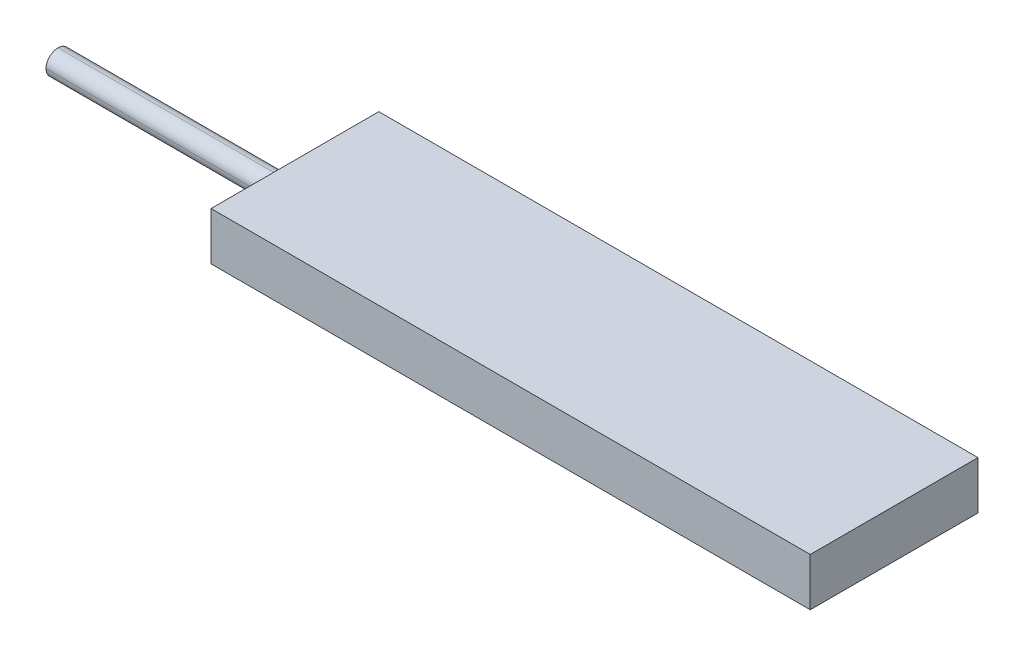
ISO-10303-21;
HEADER;
FILE_DESCRIPTION(('STEP AP214'),'2;1');
FILE_NAME('part.step','',(''),(''),'','','');
FILE_SCHEMA(('AUTOMOTIVE_DESIGN { 1 0 10303 214 1 1 1 1 }'));
ENDSEC;
DATA;
#1=APPLICATION_CONTEXT('core data for automotive mechanical design processes');
#2=APPLICATION_PROTOCOL_DEFINITION('international standard','automotive_design',2000,#1);
#3=PRODUCT_CONTEXT('',#1,'mechanical');
#4=PRODUCT('Part','Part','',(#3));
#5=PRODUCT_RELATED_PRODUCT_CATEGORY('part','',(#4));
#6=PRODUCT_DEFINITION_FORMATION('','',#4);
#7=PRODUCT_DEFINITION_CONTEXT('part definition',#1,'design');
#8=PRODUCT_DEFINITION('design','',#6,#7);
#9=PRODUCT_DEFINITION_SHAPE('','',#8);
#10=(LENGTH_UNIT() NAMED_UNIT(*) SI_UNIT(.MILLI.,.METRE.));
#11=(NAMED_UNIT(*) PLANE_ANGLE_UNIT() SI_UNIT($,.RADIAN.));
#12=(NAMED_UNIT(*) SI_UNIT($,.STERADIAN.) SOLID_ANGLE_UNIT());
#13=UNCERTAINTY_MEASURE_WITH_UNIT(LENGTH_MEASURE(1.E-05),#10,'distance_accuracy_value','');
#14=(GEOMETRIC_REPRESENTATION_CONTEXT(3) GLOBAL_UNCERTAINTY_ASSIGNED_CONTEXT((#13)) GLOBAL_UNIT_ASSIGNED_CONTEXT((#10,
#11,#12)) REPRESENTATION_CONTEXT('',''));
#15=CARTESIAN_POINT('',(0.,0.,0.));
#16=DIRECTION('',(0.,0.,1.));
#17=DIRECTION('',(1.,0.,0.));
#18=AXIS2_PLACEMENT_3D('',#15,#16,#17);
#19=CARTESIAN_POINT('',(0.,1.,-4.11315782408883));
#20=DIRECTION('',(-1.,0.,0.));
#21=DIRECTION('',(0.,0.,1.));
#22=AXIS2_PLACEMENT_3D('',#19,#20,#21);
#23=PLANE('',#22);
#24=DIRECTION('',(0.,0.,-1.));
#25=VECTOR('',#24,1.);
#26=CARTESIAN_POINT('',(0.,0.,0.));
#27=LINE('',#26,#25);
#28=CARTESIAN_POINT('',(0.,0.,0.));
#29=VERTEX_POINT('',#28);
#30=CARTESIAN_POINT('',(0.,0.,-7.));
#31=VERTEX_POINT('',#30);
#32=EDGE_CURVE('E102',#29,#31,#27,.T.);
#33=ORIENTED_EDGE('',*,*,#32,.F.);
#34=DIRECTION('',(0.,-1.,0.));
#35=VECTOR('',#34,1.);
#36=CARTESIAN_POINT('',(0.,2.,0.));
#37=LINE('',#36,#35);
#38=CARTESIAN_POINT('',(0.,2.,0.));
#39=VERTEX_POINT('',#38);
#40=EDGE_CURVE('E105',#39,#29,#37,.T.);
#41=ORIENTED_EDGE('',*,*,#40,.F.);
#42=DIRECTION('',(0.,0.,-1.));
#43=VECTOR('',#42,1.);
#44=CARTESIAN_POINT('',(0.,2.,0.));
#45=LINE('',#44,#43);
#46=CARTESIAN_POINT('',(0.,2.,-7.));
#47=VERTEX_POINT('',#46);
#48=EDGE_CURVE('E129',#39,#47,#45,.T.);
#49=ORIENTED_EDGE('',*,*,#48,.T.);
#50=DIRECTION('',(0.,-1.,0.));
#51=VECTOR('',#50,1.);
#52=CARTESIAN_POINT('',(0.,2.,-7.));
#53=LINE('',#52,#51);
#54=EDGE_CURVE('E89',#47,#31,#53,.T.);
#55=ORIENTED_EDGE('',*,*,#54,.T.);
#56=EDGE_LOOP('',(#33,#41,#49,#55));
#57=FACE_BOUND('',#56,.T.);
#58=ADVANCED_FACE('F54',(#57),#23,.T.);
#59=CARTESIAN_POINT('',(0.,0.,0.));
#60=DIRECTION('',(0.,1.,0.));
#61=DIRECTION('',(0.,0.,1.));
#62=AXIS2_PLACEMENT_3D('',#59,#60,#61);
#63=PLANE('',#62);
#64=DIRECTION('',(1.,0.,0.));
#65=VECTOR('',#64,1.);
#66=CARTESIAN_POINT('',(0.,0.,0.));
#67=LINE('',#66,#65);
#68=CARTESIAN_POINT('',(25.,0.,0.));
#69=VERTEX_POINT('',#68);
#70=EDGE_CURVE('E111',#29,#69,#67,.T.);
#71=ORIENTED_EDGE('',*,*,#70,.F.);
#72=ORIENTED_EDGE('',*,*,#32,.T.);
#73=DIRECTION('',(1.,0.,0.));
#74=VECTOR('',#73,1.);
#75=CARTESIAN_POINT('',(0.,0.,-7.));
#76=LINE('',#75,#74);
#77=CARTESIAN_POINT('',(25.,0.,-7.00000000000001));
#78=VERTEX_POINT('',#77);
#79=EDGE_CURVE('E65',#31,#78,#76,.T.);
#80=ORIENTED_EDGE('',*,*,#79,.T.);
#81=DIRECTION('',(0.,0.,1.));
#82=VECTOR('',#81,1.);
#83=CARTESIAN_POINT('',(25.,0.,0.));
#84=LINE('',#83,#82);
#85=EDGE_CURVE('E13',#78,#69,#84,.T.);
#86=ORIENTED_EDGE('',*,*,#85,.T.);
#87=EDGE_LOOP('',(#71,#72,#80,#86));
#88=FACE_BOUND('',#87,.T.);
#89=ADVANCED_FACE('F56',(#88),#63,.F.);
#90=CARTESIAN_POINT('',(25.,2.,0.));
#91=DIRECTION('',(1.,0.,0.));
#92=DIRECTION('',(0.,0.,-1.));
#93=AXIS2_PLACEMENT_3D('',#90,#91,#92);
#94=PLANE('',#93);
#95=ORIENTED_EDGE('',*,*,#85,.F.);
#96=DIRECTION('',(0.,-1.,0.));
#97=VECTOR('',#96,1.);
#98=CARTESIAN_POINT('',(25.,2.,-7.00000000000001));
#99=LINE('',#98,#97);
#100=CARTESIAN_POINT('',(25.,2.,-7.00000000000001));
#101=VERTEX_POINT('',#100);
#102=EDGE_CURVE('E74',#101,#78,#99,.T.);
#103=ORIENTED_EDGE('',*,*,#102,.F.);
#104=DIRECTION('',(0.,0.,1.));
#105=VECTOR('',#104,1.);
#106=CARTESIAN_POINT('',(25.,2.,0.));
#107=LINE('',#106,#105);
#108=CARTESIAN_POINT('',(25.,2.,0.));
#109=VERTEX_POINT('',#108);
#110=EDGE_CURVE('E58',#101,#109,#107,.T.);
#111=ORIENTED_EDGE('',*,*,#110,.T.);
#112=DIRECTION('',(0.,-1.,0.));
#113=VECTOR('',#112,1.);
#114=CARTESIAN_POINT('',(25.,2.,0.));
#115=LINE('',#114,#113);
#116=EDGE_CURVE('E98',#109,#69,#115,.T.);
#117=ORIENTED_EDGE('',*,*,#116,.T.);
#118=EDGE_LOOP('',(#95,#103,#111,#117));
#119=FACE_BOUND('',#118,.T.);
#120=ADVANCED_FACE('F135',(#119),#94,.T.);
#121=CARTESIAN_POINT('',(0.,2.,-7.));
#122=DIRECTION('',(0.,0.,-1.));
#123=DIRECTION('',(-1.,0.,0.));
#124=AXIS2_PLACEMENT_3D('',#121,#122,#123);
#125=PLANE('',#124);
#126=ORIENTED_EDGE('',*,*,#79,.F.);
#127=ORIENTED_EDGE('',*,*,#54,.F.);
#128=DIRECTION('',(1.,0.,0.));
#129=VECTOR('',#128,1.);
#130=CARTESIAN_POINT('',(0.,2.,-7.));
#131=LINE('',#130,#129);
#132=EDGE_CURVE('E122',#47,#101,#131,.T.);
#133=ORIENTED_EDGE('',*,*,#132,.T.);
#134=ORIENTED_EDGE('',*,*,#102,.T.);
#135=EDGE_LOOP('',(#126,#127,#133,#134));
#136=FACE_BOUND('',#135,.T.);
#137=ADVANCED_FACE('F132',(#136),#125,.T.);
#138=CARTESIAN_POINT('',(0.,2.,0.));
#139=DIRECTION('',(0.,0.,-1.));
#140=DIRECTION('',(-1.,0.,0.));
#141=AXIS2_PLACEMENT_3D('',#138,#139,#140);
#142=PLANE('',#141);
#143=ORIENTED_EDGE('',*,*,#70,.T.);
#144=ORIENTED_EDGE('',*,*,#116,.F.);
#145=DIRECTION('',(1.,0.,0.));
#146=VECTOR('',#145,1.);
#147=CARTESIAN_POINT('',(0.,2.,0.));
#148=LINE('',#147,#146);
#149=EDGE_CURVE('E115',#39,#109,#148,.T.);
#150=ORIENTED_EDGE('',*,*,#149,.F.);
#151=ORIENTED_EDGE('',*,*,#40,.T.);
#152=EDGE_LOOP('',(#143,#144,#150,#151));
#153=FACE_BOUND('',#152,.T.);
#154=ADVANCED_FACE('F114',(#153),#142,.F.);
#155=CARTESIAN_POINT('',(0.,2.,0.));
#156=DIRECTION('',(0.,1.,0.));
#157=DIRECTION('',(0.,0.,1.));
#158=AXIS2_PLACEMENT_3D('',#155,#156,#157);
#159=PLANE('',#158);
#160=ORIENTED_EDGE('',*,*,#110,.F.);
#161=ORIENTED_EDGE('',*,*,#132,.F.);
#162=ORIENTED_EDGE('',*,*,#48,.F.);
#163=ORIENTED_EDGE('',*,*,#149,.T.);
#164=EDGE_LOOP('',(#160,#161,#162,#163));
#165=FACE_BOUND('',#164,.T.);
#166=ADVANCED_FACE('F134',(#165),#159,.T.);
#167=CLOSED_SHELL('',(#58,#89,#120,#137,#154,#166));
#168=MANIFOLD_SOLID_BREP('B2',#167);
#169=CARTESIAN_POINT('',(0.,1.,-4.11315782408883));
#170=DIRECTION('',(-1.,0.,0.));
#171=DIRECTION('',(0.,0.,1.));
#172=AXIS2_PLACEMENT_3D('',#169,#170,#171);
#173=PLANE('',#172);
#174=CARTESIAN_POINT('',(0.,0.5,-3.61315782408883));
#175=DIRECTION('',(-1.,0.,0.));
#176=DIRECTION('',(0.,0.,1.));
#177=AXIS2_PLACEMENT_3D('',#174,#175,#176);
#178=CIRCLE('',#177,0.5);
#179=CARTESIAN_POINT('',(0.,0.5,-3.11315782408883));
#180=VERTEX_POINT('',#179);
#181=CARTESIAN_POINT('',(0.,0.,-3.61315782408883));
#182=VERTEX_POINT('',#181);
#183=EDGE_CURVE('E212',#180,#182,#178,.F.);
#184=ORIENTED_EDGE('',*,*,#183,.T.);
#185=CARTESIAN_POINT('',(0.,0.5,-3.61315782408883));
#186=DIRECTION('',(-1.,0.,0.));
#187=DIRECTION('',(0.,0.,1.));
#188=AXIS2_PLACEMENT_3D('',#185,#186,#187);
#189=CIRCLE('',#188,0.5);
#190=CARTESIAN_POINT('',(0.,0.5,-4.11315782408883));
#191=VERTEX_POINT('',#190);
#192=EDGE_CURVE('E52',#182,#191,#189,.F.);
#193=ORIENTED_EDGE('',*,*,#192,.T.);
#194=CARTESIAN_POINT('',(0.,0.5,-3.61315782408883));
#195=DIRECTION('',(-1.,0.,0.));
#196=DIRECTION('',(0.,0.,1.));
#197=AXIS2_PLACEMENT_3D('',#194,#195,#196);
#198=CIRCLE('',#197,0.5);
#199=CARTESIAN_POINT('',(0.,1.,-3.61315782408883));
#200=VERTEX_POINT('',#199);
#201=EDGE_CURVE('E205',#191,#200,#198,.F.);
#202=ORIENTED_EDGE('',*,*,#201,.T.);
#203=CARTESIAN_POINT('',(0.,0.5,-3.61315782408883));
#204=DIRECTION('',(-1.,0.,0.));
#205=DIRECTION('',(0.,0.,1.));
#206=AXIS2_PLACEMENT_3D('',#203,#204,#205);
#207=CIRCLE('',#206,0.5);
#208=EDGE_CURVE('E217',#200,#180,#207,.F.);
#209=ORIENTED_EDGE('',*,*,#208,.T.);
#210=EDGE_LOOP('',(#184,#193,#202,#209));
#211=FACE_BOUND('',#210,.T.);
#212=ADVANCED_FACE('F196',(#211),#173,.F.);
#213=CARTESIAN_POINT('',(-10.,1.,0.));
#214=DIRECTION('',(1.,0.,0.));
#215=DIRECTION('',(0.,0.,-1.));
#216=AXIS2_PLACEMENT_3D('',#213,#214,#215);
#217=PLANE('',#216);
#218=CARTESIAN_POINT('',(-10.,0.5,-3.61315782408883));
#219=DIRECTION('',(1.,0.,0.));
#220=DIRECTION('',(0.,0.,-1.));
#221=AXIS2_PLACEMENT_3D('',#218,#219,#220);
#222=CIRCLE('',#221,0.5);
#223=CARTESIAN_POINT('',(-10.,1.,-3.61315782408883));
#224=VERTEX_POINT('',#223);
#225=CARTESIAN_POINT('',(-10.,0.5,-4.11315782408883));
#226=VERTEX_POINT('',#225);
#227=EDGE_CURVE('E252',#224,#226,#222,.F.);
#228=ORIENTED_EDGE('',*,*,#227,.T.);
#229=CARTESIAN_POINT('',(-10.,0.5,-3.61315782408883));
#230=DIRECTION('',(1.,0.,0.));
#231=DIRECTION('',(0.,0.,-1.));
#232=AXIS2_PLACEMENT_3D('',#229,#230,#231);
#233=CIRCLE('',#232,0.5);
#234=CARTESIAN_POINT('',(-10.,0.,-3.61315782408883));
#235=VERTEX_POINT('',#234);
#236=EDGE_CURVE('E242',#226,#235,#233,.F.);
#237=ORIENTED_EDGE('',*,*,#236,.T.);
#238=CARTESIAN_POINT('',(-10.,0.5,-3.61315782408883));
#239=DIRECTION('',(1.,0.,0.));
#240=DIRECTION('',(0.,0.,-1.));
#241=AXIS2_PLACEMENT_3D('',#238,#239,#240);
#242=CIRCLE('',#241,0.5);
#243=CARTESIAN_POINT('',(-10.,0.5,-3.11315782408883));
#244=VERTEX_POINT('',#243);
#245=EDGE_CURVE('E248',#235,#244,#242,.F.);
#246=ORIENTED_EDGE('',*,*,#245,.T.);
#247=CARTESIAN_POINT('',(-10.,0.5,-3.61315782408883));
#248=DIRECTION('',(1.,0.,0.));
#249=DIRECTION('',(0.,0.,-1.));
#250=AXIS2_PLACEMENT_3D('',#247,#248,#249);
#251=CIRCLE('',#250,0.5);
#252=EDGE_CURVE('E253',#244,#224,#251,.F.);
#253=ORIENTED_EDGE('',*,*,#252,.T.);
#254=EDGE_LOOP('',(#228,#237,#246,#253));
#255=FACE_BOUND('',#254,.T.);
#256=ADVANCED_FACE('F255',(#255),#217,.F.);
#257=CARTESIAN_POINT('',(0.,0.5,-3.61315782408883));
#258=DIRECTION('',(-1.,0.,0.));
#259=DIRECTION('',(0.,0.,1.));
#260=AXIS2_PLACEMENT_3D('',#257,#258,#259);
#261=CYLINDRICAL_SURFACE('',#260,0.5);
#262=DIRECTION('',(1.,0.,0.));
#263=VECTOR('',#262,1.);
#264=CARTESIAN_POINT('',(0.,1.,-3.61315782408883));
#265=LINE('',#264,#263);
#266=EDGE_CURVE('E244',#224,#200,#265,.T.);
#267=ORIENTED_EDGE('',*,*,#266,.F.);
#268=ORIENTED_EDGE('',*,*,#252,.F.);
#269=DIRECTION('',(1.,0.,0.));
#270=VECTOR('',#269,1.);
#271=CARTESIAN_POINT('',(-10.,0.5,-3.11315782408883));
#272=LINE('',#271,#270);
#273=EDGE_CURVE('E200',#180,#244,#272,.F.);
#274=ORIENTED_EDGE('',*,*,#273,.F.);
#275=ORIENTED_EDGE('',*,*,#208,.F.);
#276=EDGE_LOOP('',(#267,#268,#274,#275));
#277=FACE_BOUND('',#276,.T.);
#278=ADVANCED_FACE('F198',(#277),#261,.T.);
#279=CARTESIAN_POINT('',(0.,0.5,-3.61315782408883));
#280=DIRECTION('',(1.,0.,0.));
#281=DIRECTION('',(0.,0.,-1.));
#282=AXIS2_PLACEMENT_3D('',#279,#280,#281);
#283=CYLINDRICAL_SURFACE('',#282,0.5);
#284=ORIENTED_EDGE('',*,*,#273,.T.);
#285=ORIENTED_EDGE('',*,*,#245,.F.);
#286=DIRECTION('',(1.,0.,0.));
#287=VECTOR('',#286,1.);
#288=CARTESIAN_POINT('',(0.,0.,-3.61315782408883));
#289=LINE('',#288,#287);
#290=EDGE_CURVE('E238',#182,#235,#289,.F.);
#291=ORIENTED_EDGE('',*,*,#290,.F.);
#292=ORIENTED_EDGE('',*,*,#183,.F.);
#293=EDGE_LOOP('',(#284,#285,#291,#292));
#294=FACE_BOUND('',#293,.T.);
#295=ADVANCED_FACE('F249',(#294),#283,.T.);
#296=CARTESIAN_POINT('',(0.,0.5,-3.61315782408883));
#297=DIRECTION('',(1.,0.,0.));
#298=DIRECTION('',(0.,0.,-1.));
#299=AXIS2_PLACEMENT_3D('',#296,#297,#298);
#300=CYLINDRICAL_SURFACE('',#299,0.5);
#301=ORIENTED_EDGE('',*,*,#266,.T.);
#302=ORIENTED_EDGE('',*,*,#201,.F.);
#303=DIRECTION('',(-1.,0.,0.));
#304=VECTOR('',#303,1.);
#305=CARTESIAN_POINT('',(0.,0.5,-4.11315782408883));
#306=LINE('',#305,#304);
#307=EDGE_CURVE('E245',#226,#191,#306,.F.);
#308=ORIENTED_EDGE('',*,*,#307,.F.);
#309=ORIENTED_EDGE('',*,*,#227,.F.);
#310=EDGE_LOOP('',(#301,#302,#308,#309));
#311=FACE_BOUND('',#310,.T.);
#312=ADVANCED_FACE('F270',(#311),#300,.T.);
#313=CARTESIAN_POINT('',(0.,0.5,-3.61315782408883));
#314=DIRECTION('',(-1.,0.,0.));
#315=DIRECTION('',(0.,0.,1.));
#316=AXIS2_PLACEMENT_3D('',#313,#314,#315);
#317=CYLINDRICAL_SURFACE('',#316,0.5);
#318=ORIENTED_EDGE('',*,*,#192,.F.);
#319=ORIENTED_EDGE('',*,*,#290,.T.);
#320=ORIENTED_EDGE('',*,*,#236,.F.);
#321=ORIENTED_EDGE('',*,*,#307,.T.);
#322=EDGE_LOOP('',(#318,#319,#320,#321));
#323=FACE_BOUND('',#322,.T.);
#324=ADVANCED_FACE('F240',(#323),#317,.T.);
#325=CLOSED_SHELL('',(#212,#256,#278,#295,#312,#324));
#326=MANIFOLD_SOLID_BREP('B7',#325);
#327=ADVANCED_BREP_SHAPE_REPRESENTATION('',(#18,#168,#326),#14);
#328=SHAPE_DEFINITION_REPRESENTATION(#9,#327);
ENDSEC;
END-ISO-10303-21;
